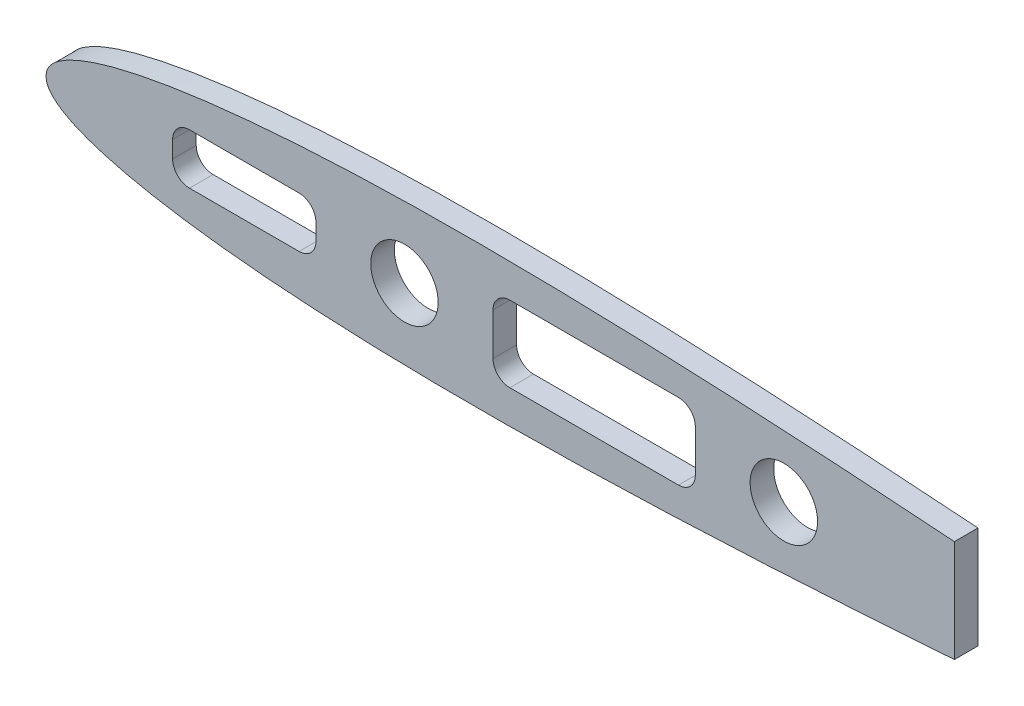
ISO-10303-21;
HEADER;
FILE_DESCRIPTION(('STEP AP214'),'2;1');
FILE_NAME('part.step','',(''),(''),'','','');
FILE_SCHEMA(('AUTOMOTIVE_DESIGN { 1 0 10303 214 1 1 1 1 }'));
ENDSEC;
DATA;
#1=APPLICATION_CONTEXT('core data for automotive mechanical design processes');
#2=APPLICATION_PROTOCOL_DEFINITION('international standard','automotive_design',2000,#1);
#3=PRODUCT_CONTEXT('',#1,'mechanical');
#4=PRODUCT('Part','Part','',(#3));
#5=PRODUCT_RELATED_PRODUCT_CATEGORY('part','',(#4));
#6=PRODUCT_DEFINITION_FORMATION('','',#4);
#7=PRODUCT_DEFINITION_CONTEXT('part definition',#1,'design');
#8=PRODUCT_DEFINITION('design','',#6,#7);
#9=PRODUCT_DEFINITION_SHAPE('','',#8);
#10=(LENGTH_UNIT() NAMED_UNIT(*) SI_UNIT(.MILLI.,.METRE.));
#11=(NAMED_UNIT(*) PLANE_ANGLE_UNIT() SI_UNIT($,.RADIAN.));
#12=(NAMED_UNIT(*) SI_UNIT($,.STERADIAN.) SOLID_ANGLE_UNIT());
#13=UNCERTAINTY_MEASURE_WITH_UNIT(LENGTH_MEASURE(1.E-05),#10,'distance_accuracy_value','');
#14=(GEOMETRIC_REPRESENTATION_CONTEXT(3) GLOBAL_UNCERTAINTY_ASSIGNED_CONTEXT((#13)) GLOBAL_UNIT_ASSIGNED_CONTEXT((#10,
#11,#12)) REPRESENTATION_CONTEXT('',''));
#15=CARTESIAN_POINT('',(0.,0.,0.));
#16=DIRECTION('',(0.,0.,1.));
#17=DIRECTION('',(1.,0.,0.));
#18=AXIS2_PLACEMENT_3D('',#15,#16,#17);
#19=CARTESIAN_POINT('',(217.74763411893,0.,1.4));
#20=DIRECTION('',(1.,0.,0.));
#21=DIRECTION('',(0.,0.,-1.));
#22=AXIS2_PLACEMENT_3D('',#19,#20,#21);
#23=PLANE('',#22);
#24=DIRECTION('',(0.,-1.,0.));
#25=VECTOR('',#24,1.);
#26=CARTESIAN_POINT('',(217.74763411893,0.,-1.4));
#27=LINE('',#26,#25);
#28=CARTESIAN_POINT('',(217.74763411893,6.05811307778919,-1.4));
#29=VERTEX_POINT('',#28);
#30=CARTESIAN_POINT('',(217.74763411893,-6.05811307778918,-1.4));
#31=VERTEX_POINT('',#30);
#32=EDGE_CURVE('E185',#29,#31,#27,.T.);
#33=ORIENTED_EDGE('',*,*,#32,.F.);
#34=DIRECTION('',(0.,0.,-1.));
#35=VECTOR('',#34,1.);
#36=CARTESIAN_POINT('',(217.74763411893,6.05811307778919,1.4));
#37=LINE('',#36,#35);
#38=CARTESIAN_POINT('',(217.74763411893,6.05811307778919,1.4));
#39=VERTEX_POINT('',#38);
#40=EDGE_CURVE('E11',#39,#29,#37,.T.);
#41=ORIENTED_EDGE('',*,*,#40,.F.);
#42=DIRECTION('',(0.,-1.,0.));
#43=VECTOR('',#42,1.);
#44=CARTESIAN_POINT('',(217.74763411893,0.,1.4));
#45=LINE('',#44,#43);
#46=CARTESIAN_POINT('',(217.74763411893,-6.05811307778918,1.4));
#47=VERTEX_POINT('',#46);
#48=EDGE_CURVE('E184',#39,#47,#45,.T.);
#49=ORIENTED_EDGE('',*,*,#48,.T.);
#50=DIRECTION('',(0.,0.,-1.));
#51=VECTOR('',#50,1.);
#52=CARTESIAN_POINT('',(217.74763411893,-6.05811307778918,1.4));
#53=LINE('',#52,#51);
#54=EDGE_CURVE('E129',#47,#31,#53,.T.);
#55=ORIENTED_EDGE('',*,*,#54,.T.);
#56=EDGE_LOOP('',(#33,#41,#49,#55));
#57=FACE_BOUND('',#56,.T.);
#58=ADVANCED_FACE('F41',(#57),#23,.T.);
#59=CARTESIAN_POINT('',(280.,0.1785,1.4));
#60=CARTESIAN_POINT('',(279.592043703671,0.226075897783467,1.4));
#61=CARTESIAN_POINT('',(278.452596210234,0.358958360844463,1.4));
#62=CARTESIAN_POINT('',(276.385426802208,0.596436481937331,1.4));
#63=CARTESIAN_POINT('',(273.651166983567,0.905304265461348,1.4));
#64=CARTESIAN_POINT('',(270.455833183168,1.25859090467058,1.4));
#65=CARTESIAN_POINT('',(266.898988861825,1.64260730411104,1.4));
#66=CARTESIAN_POINT('',(263.047743378214,2.04785660385741,1.4));
#67=CARTESIAN_POINT('',(258.952644661846,2.46718813772148,1.4));
#68=CARTESIAN_POINT('',(253.11611192075,3.04786904369115,1.4));
#69=CARTESIAN_POINT('',(247.071089235748,3.62220530992837,1.4));
#70=CARTESIAN_POINT('',(240.854179313273,4.18491264898859,1.4));
#71=CARTESIAN_POINT('',(236.038226964104,4.60581174883637,1.4));
#72=CARTESIAN_POINT('',(231.150377302514,5.0173511026198,1.4));
#73=CARTESIAN_POINT('',(226.209311113549,5.41695826474113,1.4));
#74=CARTESIAN_POINT('',(221.232257466585,5.802244474926,1.4));
#75=CARTESIAN_POINT('',(216.235178286272,6.17086457697306,1.4));
#76=CARTESIAN_POINT('',(211.232977593233,6.52047434958791,1.4));
#77=CARTESIAN_POINT('',(206.239642946259,6.84887299963153,1.4));
#78=CARTESIAN_POINT('',(201.268368916985,7.15382688632495,1.4));
#79=CARTESIAN_POINT('',(196.331634567492,7.43310533690328,1.4));
#80=CARTESIAN_POINT('',(191.441311474098,7.68460443906704,1.4));
#81=CARTESIAN_POINT('',(186.608700126931,7.90621829286941,1.4));
#82=CARTESIAN_POINT('',(181.844626933159,8.09595849303594,1.4));
#83=CARTESIAN_POINT('',(177.159453511195,8.25195768192942,1.4));
#84=CARTESIAN_POINT('',(172.563150271755,8.37248656398387,1.4));
#85=CARTESIAN_POINT('',(168.065295924147,8.45595366245417,1.4));
#86=CARTESIAN_POINT('',(163.675147454163,8.5010026998616,1.4));
#87=CARTESIAN_POINT('',(159.401643403725,8.50652296727326,1.4));
#88=CARTESIAN_POINT('',(155.253439755899,8.47152880790102,1.4));
#89=CARTESIAN_POINT('',(151.238917925322,8.39550607585732,1.4));
#90=CARTESIAN_POINT('',(147.366223919106,8.27798597685019,1.4));
#91=CARTESIAN_POINT('',(143.643266298458,8.11897556141504,1.4));
#92=CARTESIAN_POINT('',(140.077743555427,7.91867894287145,1.4));
#93=CARTESIAN_POINT('',(136.677139412155,7.67760454203032,1.4));
#94=CARTESIAN_POINT('',(133.44876289533,7.39648056861162,1.4));
#95=CARTESIAN_POINT('',(130.399721685833,7.07642431038863,1.4));
#96=CARTESIAN_POINT('',(127.536961088608,6.71865034112428,1.4));
#97=CARTESIAN_POINT('',(124.867245825052,6.32466607739586,1.4));
#98=CARTESIAN_POINT('',(122.397158973637,5.89612056643678,1.4));
#99=CARTESIAN_POINT('',(120.133109351335,5.43479747619412,1.4));
#100=CARTESIAN_POINT('',(118.081312132678,4.94256764101073,1.4));
#101=CARTESIAN_POINT('',(116.247665797811,4.42139238611828,1.4));
#102=CARTESIAN_POINT('',(114.637939719778,3.87306046577258,1.4));
#103=CARTESIAN_POINT('',(113.256788366372,3.29930923783808,1.4));
#104=CARTESIAN_POINT('',(112.109835923497,2.70130638754162,1.4));
#105=CARTESIAN_POINT('',(111.196336340545,2.07855523302877,1.4));
#106=CARTESIAN_POINT('',(110.530223641577,1.42706975809109,1.4));
#107=CARTESIAN_POINT('',(110.085538217979,0.734230220465984,1.4));
#108=CARTESIAN_POINT('',(110.027578175867,0.236721440142773,1.4));
#109=CARTESIAN_POINT('',(110.,0.,1.4));
#110=B_SPLINE_CURVE_WITH_KNOTS('',3,(#59,#60,#61,#62,#63,#64,#65,#66,#67,#68,#69,#70,#71,#72,
#73,#74,#75,#76,#77,#78,#79,#80,#81,#82,#83,#84,#85,#86,#87,#88,#89,#90,#91,#92,#93,#94,#95,#96,
#97,#98,#99,#100,#101,#102,#103,#104,#105,#106,#107,#108,#109),.UNSPECIFIED.,.F.,.F.,(4,1,1,1,1,
1,1,1,1,1,1,1,1,1,1,1,1,1,1,1,1,1,1,1,1,1,1,1,1,1,1,1,1,1,1,1,1,1,1,1,1,1,1,1,1,1,1,1,4),(0.,
0.00714472364101537,0.0199556607345446,0.0361960612227423,0.0550111837630616,0.0758789375062231,
0.0984288660950085,0.122375554002083,0.147487885417653,0.200459747132314,0.228005170188377,
0.256076453638138,0.284555151070125,0.31333276259982,0.342309553949656,0.371392651251454,
0.400495752426115,0.429537687145242,0.458441905920554,0.487136113386761,0.515551917136779,
0.543623846405843,0.571289984327897,0.598490809568145,0.625169613225281,0.651272029103837,
0.676746157949116,0.701541790883913,0.725611016556625,0.74890783507394,0.771387785068823,
0.793008138575143,0.813728032856974,0.833507815357633,0.852309696093785,0.870097310144046,
0.886835918069106,0.902492781713446,0.917037139140432,0.930441053860646,0.942679762162792,
0.953733567025024,0.963589785484808,0.97224701929817,0.979722225388436,0.986065145275041,
0.991385258303778,0.995900988803729,1.),.UNSPECIFIED.);
#111=DIRECTION('',(0.,0.,-1.));
#112=VECTOR('',#111,1.);
#113=SURFACE_OF_LINEAR_EXTRUSION('',#110,#112);
#114=CARTESIAN_POINT('',(280.,0.1785,-1.4));
#115=CARTESIAN_POINT('',(279.592043703671,0.226075897783467,-1.4));
#116=CARTESIAN_POINT('',(278.452596210234,0.358958360844463,-1.4));
#117=CARTESIAN_POINT('',(276.385426802208,0.596436481937331,-1.4));
#118=CARTESIAN_POINT('',(273.651166983567,0.905304265461348,-1.4));
#119=CARTESIAN_POINT('',(270.455833183168,1.25859090467058,-1.4));
#120=CARTESIAN_POINT('',(266.898988861825,1.64260730411104,-1.4));
#121=CARTESIAN_POINT('',(263.047743378214,2.04785660385741,-1.4));
#122=CARTESIAN_POINT('',(258.952644661846,2.46718813772148,-1.4));
#123=CARTESIAN_POINT('',(253.11611192075,3.04786904369115,-1.4));
#124=CARTESIAN_POINT('',(247.071089235748,3.62220530992837,-1.4));
#125=CARTESIAN_POINT('',(240.854179313273,4.18491264898859,-1.4));
#126=CARTESIAN_POINT('',(236.038226964104,4.60581174883637,-1.4));
#127=CARTESIAN_POINT('',(231.150377302514,5.0173511026198,-1.4));
#128=CARTESIAN_POINT('',(226.209311113549,5.41695826474113,-1.4));
#129=CARTESIAN_POINT('',(221.232257466585,5.802244474926,-1.4));
#130=CARTESIAN_POINT('',(216.235178286272,6.17086457697306,-1.4));
#131=CARTESIAN_POINT('',(211.232977593233,6.52047434958791,-1.4));
#132=CARTESIAN_POINT('',(206.239642946259,6.84887299963153,-1.4));
#133=CARTESIAN_POINT('',(201.268368916985,7.15382688632495,-1.4));
#134=CARTESIAN_POINT('',(196.331634567492,7.43310533690328,-1.4));
#135=CARTESIAN_POINT('',(191.441311474098,7.68460443906704,-1.4));
#136=CARTESIAN_POINT('',(186.608700126931,7.90621829286941,-1.4));
#137=CARTESIAN_POINT('',(181.844626933159,8.09595849303594,-1.4));
#138=CARTESIAN_POINT('',(177.159453511195,8.25195768192942,-1.4));
#139=CARTESIAN_POINT('',(172.563150271755,8.37248656398387,-1.4));
#140=CARTESIAN_POINT('',(168.065295924147,8.45595366245417,-1.4));
#141=CARTESIAN_POINT('',(163.675147454163,8.5010026998616,-1.4));
#142=CARTESIAN_POINT('',(159.401643403725,8.50652296727326,-1.4));
#143=CARTESIAN_POINT('',(155.253439755899,8.47152880790102,-1.4));
#144=CARTESIAN_POINT('',(151.238917925322,8.39550607585732,-1.4));
#145=CARTESIAN_POINT('',(147.366223919106,8.27798597685019,-1.4));
#146=CARTESIAN_POINT('',(143.643266298458,8.11897556141504,-1.4));
#147=CARTESIAN_POINT('',(140.077743555427,7.91867894287145,-1.4));
#148=CARTESIAN_POINT('',(136.677139412155,7.67760454203032,-1.4));
#149=CARTESIAN_POINT('',(133.44876289533,7.39648056861162,-1.4));
#150=CARTESIAN_POINT('',(130.399721685833,7.07642431038863,-1.4));
#151=CARTESIAN_POINT('',(127.536961088608,6.71865034112428,-1.4));
#152=CARTESIAN_POINT('',(124.867245825052,6.32466607739586,-1.4));
#153=CARTESIAN_POINT('',(122.397158973637,5.89612056643678,-1.4));
#154=CARTESIAN_POINT('',(120.133109351335,5.43479747619412,-1.4));
#155=CARTESIAN_POINT('',(118.081312132678,4.94256764101073,-1.4));
#156=CARTESIAN_POINT('',(116.247665797811,4.42139238611828,-1.4));
#157=CARTESIAN_POINT('',(114.637939719778,3.87306046577258,-1.4));
#158=CARTESIAN_POINT('',(113.256788366372,3.29930923783808,-1.4));
#159=CARTESIAN_POINT('',(112.109835923497,2.70130638754162,-1.4));
#160=CARTESIAN_POINT('',(111.196336340545,2.07855523302877,-1.4));
#161=CARTESIAN_POINT('',(110.530223641577,1.42706975809109,-1.4));
#162=CARTESIAN_POINT('',(110.085538217979,0.734230220465984,-1.4));
#163=CARTESIAN_POINT('',(110.027578175867,0.236721440142773,-1.4));
#164=CARTESIAN_POINT('',(110.,0.,-1.4));
#165=B_SPLINE_CURVE_WITH_KNOTS('',3,(#114,#115,#116,#117,#118,#119,#120,#121,#122,#123,#124,
#125,#126,#127,#128,#129,#130,#131,#132,#133,#134,#135,#136,#137,#138,#139,#140,#141,#142,#143,
#144,#145,#146,#147,#148,#149,#150,#151,#152,#153,#154,#155,#156,#157,#158,#159,#160,#161,#162,
#163,#164),.UNSPECIFIED.,.F.,.F.,(4,1,1,1,1,1,1,1,1,1,1,1,1,1,1,1,1,1,1,1,1,1,1,1,1,1,1,1,1,1,1,
1,1,1,1,1,1,1,1,1,1,1,1,1,1,1,1,1,4),(0.,0.00714472364101537,0.0199556607345446,
0.0361960612227423,0.0550111837630616,0.0758789375062231,0.0984288660950085,0.122375554002083,
0.147487885417653,0.200459747132314,0.228005170188377,0.256076453638138,0.284555151070125,
0.31333276259982,0.342309553949656,0.371392651251454,0.400495752426115,0.429537687145242,
0.458441905920554,0.487136113386761,0.515551917136779,0.543623846405843,0.571289984327897,
0.598490809568145,0.625169613225281,0.651272029103837,0.676746157949116,0.701541790883913,
0.725611016556625,0.74890783507394,0.771387785068823,0.793008138575143,0.813728032856974,
0.833507815357633,0.852309696093785,0.870097310144046,0.886835918069106,0.902492781713446,
0.917037139140432,0.930441053860646,0.942679762162792,0.953733567025024,0.963589785484808,
0.97224701929817,0.979722225388436,0.986065145275041,0.991385258303778,0.995900988803729,1.),.UNSPECIFIED.);
#166=CARTESIAN_POINT('',(110.,0.,-1.4));
#167=VERTEX_POINT('',#166);
#168=EDGE_CURVE('E366',#29,#167,#165,.T.);
#169=ORIENTED_EDGE('',*,*,#168,.T.);
#170=DIRECTION('',(0.,0.,-1.));
#171=VECTOR('',#170,1.);
#172=CARTESIAN_POINT('',(110.,0.,1.4));
#173=LINE('',#172,#171);
#174=CARTESIAN_POINT('',(110.,0.,1.4));
#175=VERTEX_POINT('',#174);
#176=EDGE_CURVE('E52',#175,#167,#173,.T.);
#177=ORIENTED_EDGE('',*,*,#176,.F.);
#178=EDGE_CURVE('E189',#39,#175,#110,.T.);
#179=ORIENTED_EDGE('',*,*,#178,.F.);
#180=ORIENTED_EDGE('',*,*,#40,.T.);
#181=EDGE_LOOP('',(#169,#177,#179,#180));
#182=FACE_BOUND('',#181,.T.);
#183=ADVANCED_FACE('F190',(#182),#113,.F.);
#184=CARTESIAN_POINT('',(163.018484280221,0.,1.4));
#185=DIRECTION('',(-1.,0.,0.));
#186=DIRECTION('',(0.,0.,1.));
#187=AXIS2_PLACEMENT_3D('',#184,#185,#186);
#188=PLANE('',#187);
#189=DIRECTION('',(0.,1.,0.));
#190=VECTOR('',#189,1.);
#191=CARTESIAN_POINT('',(163.018484280221,0.,-1.4));
#192=LINE('',#191,#190);
#193=CARTESIAN_POINT('',(163.018484280221,-2.5,-1.4));
#194=VERTEX_POINT('',#193);
#195=CARTESIAN_POINT('',(163.018484280221,2.5,-1.4));
#196=VERTEX_POINT('',#195);
#197=EDGE_CURVE('E327',#194,#196,#192,.T.);
#198=ORIENTED_EDGE('',*,*,#197,.T.);
#199=DIRECTION('',(0.,0.,-1.));
#200=VECTOR('',#199,1.);
#201=CARTESIAN_POINT('',(163.018484280221,2.5,1.4));
#202=LINE('',#201,#200);
#203=CARTESIAN_POINT('',(163.018484280221,2.5,1.4));
#204=VERTEX_POINT('',#203);
#205=EDGE_CURVE('E384',#204,#196,#202,.T.);
#206=ORIENTED_EDGE('',*,*,#205,.F.);
#207=DIRECTION('',(0.,1.,0.));
#208=VECTOR('',#207,1.);
#209=CARTESIAN_POINT('',(163.018484280221,0.,1.4));
#210=LINE('',#209,#208);
#211=CARTESIAN_POINT('',(163.018484280221,-2.5,1.4));
#212=VERTEX_POINT('',#211);
#213=EDGE_CURVE('E463',#212,#204,#210,.T.);
#214=ORIENTED_EDGE('',*,*,#213,.F.);
#215=DIRECTION('',(0.,0.,-1.));
#216=VECTOR('',#215,1.);
#217=CARTESIAN_POINT('',(163.018484280221,-2.5,1.4));
#218=LINE('',#217,#216);
#219=EDGE_CURVE('E387',#212,#194,#218,.T.);
#220=ORIENTED_EDGE('',*,*,#219,.T.);
#221=EDGE_LOOP('',(#198,#206,#214,#220));
#222=FACE_BOUND('',#221,.T.);
#223=ADVANCED_FACE('F217',(#222),#188,.F.);
#224=CARTESIAN_POINT('',(165.018484280221,2.5,1.4));
#225=DIRECTION('',(0.,0.,-1.));
#226=DIRECTION('',(-1.,0.,0.));
#227=AXIS2_PLACEMENT_3D('',#224,#225,#226);
#228=CYLINDRICAL_SURFACE('',#227,2.);
#229=CARTESIAN_POINT('',(165.018484280221,2.5,-1.4));
#230=DIRECTION('',(0.,0.,1.));
#231=DIRECTION('',(1.,0.,0.));
#232=AXIS2_PLACEMENT_3D('',#229,#230,#231);
#233=CIRCLE('',#232,2.);
#234=CARTESIAN_POINT('',(165.018484280221,4.5,-1.4));
#235=VERTEX_POINT('',#234);
#236=EDGE_CURVE('E331',#196,#235,#233,.F.);
#237=ORIENTED_EDGE('',*,*,#236,.T.);
#238=DIRECTION('',(0.,0.,-1.));
#239=VECTOR('',#238,1.);
#240=CARTESIAN_POINT('',(165.018484280221,4.5,1.4));
#241=LINE('',#240,#239);
#242=CARTESIAN_POINT('',(165.018484280221,4.5,1.4));
#243=VERTEX_POINT('',#242);
#244=EDGE_CURVE('E407',#243,#235,#241,.T.);
#245=ORIENTED_EDGE('',*,*,#244,.F.);
#246=CARTESIAN_POINT('',(165.018484280221,2.5,1.4));
#247=DIRECTION('',(0.,0.,1.));
#248=DIRECTION('',(1.,0.,0.));
#249=AXIS2_PLACEMENT_3D('',#246,#247,#248);
#250=CIRCLE('',#249,2.);
#251=EDGE_CURVE('E467',#204,#243,#250,.F.);
#252=ORIENTED_EDGE('',*,*,#251,.F.);
#253=ORIENTED_EDGE('',*,*,#205,.T.);
#254=EDGE_LOOP('',(#237,#245,#252,#253));
#255=FACE_BOUND('',#254,.T.);
#256=ADVANCED_FACE('F255',(#255),#228,.F.);
#257=CARTESIAN_POINT('',(0.,4.5,1.4));
#258=DIRECTION('',(0.,1.,0.));
#259=DIRECTION('',(0.,0.,1.));
#260=AXIS2_PLACEMENT_3D('',#257,#258,#259);
#261=PLANE('',#260);
#262=DIRECTION('',(1.,0.,0.));
#263=VECTOR('',#262,1.);
#264=CARTESIAN_POINT('',(0.,4.5,-1.4));
#265=LINE('',#264,#263);
#266=CARTESIAN_POINT('',(185.018484280221,4.5,-1.4));
#267=VERTEX_POINT('',#266);
#268=EDGE_CURVE('E334',#235,#267,#265,.T.);
#269=ORIENTED_EDGE('',*,*,#268,.T.);
#270=DIRECTION('',(0.,0.,-1.));
#271=VECTOR('',#270,1.);
#272=CARTESIAN_POINT('',(185.018484280221,4.5,1.4));
#273=LINE('',#272,#271);
#274=CARTESIAN_POINT('',(185.018484280221,4.5,1.4));
#275=VERTEX_POINT('',#274);
#276=EDGE_CURVE('E403',#275,#267,#273,.T.);
#277=ORIENTED_EDGE('',*,*,#276,.F.);
#278=DIRECTION('',(1.,0.,0.));
#279=VECTOR('',#278,1.);
#280=CARTESIAN_POINT('',(0.,4.5,1.4));
#281=LINE('',#280,#279);
#282=EDGE_CURVE('E470',#243,#275,#281,.T.);
#283=ORIENTED_EDGE('',*,*,#282,.F.);
#284=ORIENTED_EDGE('',*,*,#244,.T.);
#285=EDGE_LOOP('',(#269,#277,#283,#284));
#286=FACE_BOUND('',#285,.T.);
#287=ADVANCED_FACE('F251',(#286),#261,.F.);
#288=CARTESIAN_POINT('',(185.018484280221,2.5,1.4));
#289=DIRECTION('',(0.,0.,-1.));
#290=DIRECTION('',(-1.,0.,0.));
#291=AXIS2_PLACEMENT_3D('',#288,#289,#290);
#292=CYLINDRICAL_SURFACE('',#291,2.);
#293=CARTESIAN_POINT('',(185.018484280221,2.5,-1.4));
#294=DIRECTION('',(0.,0.,1.));
#295=DIRECTION('',(1.,0.,0.));
#296=AXIS2_PLACEMENT_3D('',#293,#294,#295);
#297=CIRCLE('',#296,2.);
#298=CARTESIAN_POINT('',(187.018484280221,2.5,-1.4));
#299=VERTEX_POINT('',#298);
#300=EDGE_CURVE('E337',#267,#299,#297,.F.);
#301=ORIENTED_EDGE('',*,*,#300,.T.);
#302=DIRECTION('',(0.,0.,-1.));
#303=VECTOR('',#302,1.);
#304=CARTESIAN_POINT('',(187.018484280221,2.5,1.4));
#305=LINE('',#304,#303);
#306=CARTESIAN_POINT('',(187.018484280221,2.5,1.4));
#307=VERTEX_POINT('',#306);
#308=EDGE_CURVE('E400',#307,#299,#305,.T.);
#309=ORIENTED_EDGE('',*,*,#308,.F.);
#310=CARTESIAN_POINT('',(185.018484280221,2.5,1.4));
#311=DIRECTION('',(0.,0.,1.));
#312=DIRECTION('',(1.,0.,0.));
#313=AXIS2_PLACEMENT_3D('',#310,#311,#312);
#314=CIRCLE('',#313,2.);
#315=EDGE_CURVE('E473',#275,#307,#314,.F.);
#316=ORIENTED_EDGE('',*,*,#315,.F.);
#317=ORIENTED_EDGE('',*,*,#276,.T.);
#318=EDGE_LOOP('',(#301,#309,#316,#317));
#319=FACE_BOUND('',#318,.T.);
#320=ADVANCED_FACE('F247',(#319),#292,.F.);
#321=CARTESIAN_POINT('',(187.018484280221,0.,1.4));
#322=DIRECTION('',(-1.,0.,0.));
#323=DIRECTION('',(0.,0.,1.));
#324=AXIS2_PLACEMENT_3D('',#321,#322,#323);
#325=PLANE('',#324);
#326=DIRECTION('',(0.,1.,0.));
#327=VECTOR('',#326,1.);
#328=CARTESIAN_POINT('',(187.018484280221,0.,-1.4));
#329=LINE('',#328,#327);
#330=CARTESIAN_POINT('',(187.018484280221,-2.5,-1.4));
#331=VERTEX_POINT('',#330);
#332=EDGE_CURVE('E341',#331,#299,#329,.T.);
#333=ORIENTED_EDGE('',*,*,#332,.F.);
#334=DIRECTION('',(0.,0.,-1.));
#335=VECTOR('',#334,1.);
#336=CARTESIAN_POINT('',(187.018484280221,-2.5,1.4));
#337=LINE('',#336,#335);
#338=CARTESIAN_POINT('',(187.018484280221,-2.5,1.4));
#339=VERTEX_POINT('',#338);
#340=EDGE_CURVE('E397',#339,#331,#337,.T.);
#341=ORIENTED_EDGE('',*,*,#340,.F.);
#342=DIRECTION('',(0.,1.,0.));
#343=VECTOR('',#342,1.);
#344=CARTESIAN_POINT('',(187.018484280221,0.,1.4));
#345=LINE('',#344,#343);
#346=EDGE_CURVE('E476',#339,#307,#345,.T.);
#347=ORIENTED_EDGE('',*,*,#346,.T.);
#348=ORIENTED_EDGE('',*,*,#308,.T.);
#349=EDGE_LOOP('',(#333,#341,#347,#348));
#350=FACE_BOUND('',#349,.T.);
#351=ADVANCED_FACE('F243',(#350),#325,.T.);
#352=CARTESIAN_POINT('',(185.018484280221,-2.5,1.4));
#353=DIRECTION('',(0.,0.,-1.));
#354=DIRECTION('',(-1.,0.,0.));
#355=AXIS2_PLACEMENT_3D('',#352,#353,#354);
#356=CYLINDRICAL_SURFACE('',#355,2.);
#357=CARTESIAN_POINT('',(185.018484280221,-2.5,-1.4));
#358=DIRECTION('',(0.,0.,1.));
#359=DIRECTION('',(1.,0.,0.));
#360=AXIS2_PLACEMENT_3D('',#357,#358,#359);
#361=CIRCLE('',#360,2.);
#362=CARTESIAN_POINT('',(185.018484280221,-4.5,-1.4));
#363=VERTEX_POINT('',#362);
#364=EDGE_CURVE('E345',#363,#331,#361,.T.);
#365=ORIENTED_EDGE('',*,*,#364,.F.);
#366=DIRECTION('',(0.,0.,-1.));
#367=VECTOR('',#366,1.);
#368=CARTESIAN_POINT('',(185.018484280221,-4.5,1.4));
#369=LINE('',#368,#367);
#370=CARTESIAN_POINT('',(185.018484280221,-4.5,1.4));
#371=VERTEX_POINT('',#370);
#372=EDGE_CURVE('E394',#371,#363,#369,.T.);
#373=ORIENTED_EDGE('',*,*,#372,.F.);
#374=CARTESIAN_POINT('',(185.018484280221,-2.5,1.4));
#375=DIRECTION('',(0.,0.,1.));
#376=DIRECTION('',(1.,0.,0.));
#377=AXIS2_PLACEMENT_3D('',#374,#375,#376);
#378=CIRCLE('',#377,2.);
#379=EDGE_CURVE('E480',#371,#339,#378,.T.);
#380=ORIENTED_EDGE('',*,*,#379,.T.);
#381=ORIENTED_EDGE('',*,*,#340,.T.);
#382=EDGE_LOOP('',(#365,#373,#380,#381));
#383=FACE_BOUND('',#382,.T.);
#384=ADVANCED_FACE('F239',(#383),#356,.F.);
#385=CARTESIAN_POINT('',(0.,-4.5,1.4));
#386=DIRECTION('',(0.,1.,0.));
#387=DIRECTION('',(0.,0.,1.));
#388=AXIS2_PLACEMENT_3D('',#385,#386,#387);
#389=PLANE('',#388);
#390=DIRECTION('',(1.,0.,0.));
#391=VECTOR('',#390,1.);
#392=CARTESIAN_POINT('',(0.,-4.5,-1.4));
#393=LINE('',#392,#391);
#394=CARTESIAN_POINT('',(165.018484280221,-4.5,-1.4));
#395=VERTEX_POINT('',#394);
#396=EDGE_CURVE('E349',#395,#363,#393,.T.);
#397=ORIENTED_EDGE('',*,*,#396,.F.);
#398=DIRECTION('',(0.,0.,-1.));
#399=VECTOR('',#398,1.);
#400=CARTESIAN_POINT('',(165.018484280221,-4.5,1.4));
#401=LINE('',#400,#399);
#402=CARTESIAN_POINT('',(165.018484280221,-4.5,1.4));
#403=VERTEX_POINT('',#402);
#404=EDGE_CURVE('E391',#403,#395,#401,.T.);
#405=ORIENTED_EDGE('',*,*,#404,.F.);
#406=DIRECTION('',(1.,0.,0.));
#407=VECTOR('',#406,1.);
#408=CARTESIAN_POINT('',(0.,-4.5,1.4));
#409=LINE('',#408,#407);
#410=EDGE_CURVE('E484',#403,#371,#409,.T.);
#411=ORIENTED_EDGE('',*,*,#410,.T.);
#412=ORIENTED_EDGE('',*,*,#372,.T.);
#413=EDGE_LOOP('',(#397,#405,#411,#412));
#414=FACE_BOUND('',#413,.T.);
#415=ADVANCED_FACE('F236',(#414),#389,.T.);
#416=CARTESIAN_POINT('',(0.,3.,1.4));
#417=DIRECTION('',(0.,1.,0.));
#418=DIRECTION('',(0.,0.,1.));
#419=AXIS2_PLACEMENT_3D('',#416,#417,#418);
#420=PLANE('',#419);
#421=DIRECTION('',(1.,0.,0.));
#422=VECTOR('',#421,1.);
#423=CARTESIAN_POINT('',(0.,3.,-1.4));
#424=LINE('',#423,#422);
#425=CARTESIAN_POINT('',(127.018484280221,3.,-1.4));
#426=VERTEX_POINT('',#425);
#427=CARTESIAN_POINT('',(140.018484280221,3.,-1.4));
#428=VERTEX_POINT('',#427);
#429=EDGE_CURVE('E301',#426,#428,#424,.T.);
#430=ORIENTED_EDGE('',*,*,#429,.T.);
#431=DIRECTION('',(0.,0.,-1.));
#432=VECTOR('',#431,1.);
#433=CARTESIAN_POINT('',(140.018484280221,3.,1.4));
#434=LINE('',#433,#432);
#435=CARTESIAN_POINT('',(140.018484280221,3.,1.4));
#436=VERTEX_POINT('',#435);
#437=EDGE_CURVE('E45',#436,#428,#434,.T.);
#438=ORIENTED_EDGE('',*,*,#437,.F.);
#439=DIRECTION('',(1.,0.,0.));
#440=VECTOR('',#439,1.);
#441=CARTESIAN_POINT('',(0.,3.,1.4));
#442=LINE('',#441,#440);
#443=CARTESIAN_POINT('',(127.018484280221,3.,1.4));
#444=VERTEX_POINT('',#443);
#445=EDGE_CURVE('E378',#444,#436,#442,.T.);
#446=ORIENTED_EDGE('',*,*,#445,.F.);
#447=DIRECTION('',(0.,0.,-1.));
#448=VECTOR('',#447,1.);
#449=CARTESIAN_POINT('',(127.018484280221,3.,1.4));
#450=LINE('',#449,#448);
#451=EDGE_CURVE('E414',#444,#426,#450,.T.);
#452=ORIENTED_EDGE('',*,*,#451,.T.);
#453=EDGE_LOOP('',(#430,#438,#446,#452));
#454=FACE_BOUND('',#453,.T.);
#455=ADVANCED_FACE('F43',(#454),#420,.F.);
#456=CARTESIAN_POINT('',(140.018484280221,1.,1.4));
#457=DIRECTION('',(0.,0.,-1.));
#458=DIRECTION('',(-1.,0.,0.));
#459=AXIS2_PLACEMENT_3D('',#456,#457,#458);
#460=CYLINDRICAL_SURFACE('',#459,2.);
#461=CARTESIAN_POINT('',(140.018484280221,1.,-1.4));
#462=DIRECTION('',(0.,0.,1.));
#463=DIRECTION('',(1.,0.,0.));
#464=AXIS2_PLACEMENT_3D('',#461,#462,#463);
#465=CIRCLE('',#464,2.);
#466=CARTESIAN_POINT('',(142.018484280221,0.999999999999986,-1.4));
#467=VERTEX_POINT('',#466);
#468=EDGE_CURVE('E291',#428,#467,#465,.F.);
#469=ORIENTED_EDGE('',*,*,#468,.T.);
#470=DIRECTION('',(0.,0.,-1.));
#471=VECTOR('',#470,1.);
#472=CARTESIAN_POINT('',(142.018484280221,0.999999999999986,1.4));
#473=LINE('',#472,#471);
#474=CARTESIAN_POINT('',(142.018484280221,0.999999999999986,1.4));
#475=VERTEX_POINT('',#474);
#476=EDGE_CURVE('E293',#475,#467,#473,.T.);
#477=ORIENTED_EDGE('',*,*,#476,.F.);
#478=CARTESIAN_POINT('',(140.018484280221,1.,1.4));
#479=DIRECTION('',(0.,0.,1.));
#480=DIRECTION('',(1.,0.,0.));
#481=AXIS2_PLACEMENT_3D('',#478,#479,#480);
#482=CIRCLE('',#481,2.);
#483=EDGE_CURVE('E137',#436,#475,#482,.F.);
#484=ORIENTED_EDGE('',*,*,#483,.F.);
#485=ORIENTED_EDGE('',*,*,#437,.T.);
#486=EDGE_LOOP('',(#469,#477,#484,#485));
#487=FACE_BOUND('',#486,.T.);
#488=ADVANCED_FACE('F283',(#487),#460,.F.);
#489=CARTESIAN_POINT('',(142.018484280221,0.,1.4));
#490=DIRECTION('',(-1.,0.,0.));
#491=DIRECTION('',(0.,0.,1.));
#492=AXIS2_PLACEMENT_3D('',#489,#490,#491);
#493=PLANE('',#492);
#494=DIRECTION('',(0.,1.,0.));
#495=VECTOR('',#494,1.);
#496=CARTESIAN_POINT('',(142.018484280221,0.,-1.4));
#497=LINE('',#496,#495);
#498=CARTESIAN_POINT('',(142.018484280221,-0.999999999999985,-1.4));
#499=VERTEX_POINT('',#498);
#500=EDGE_CURVE('E300',#499,#467,#497,.T.);
#501=ORIENTED_EDGE('',*,*,#500,.F.);
#502=DIRECTION('',(0.,0.,-1.));
#503=VECTOR('',#502,1.);
#504=CARTESIAN_POINT('',(142.018484280221,-0.999999999999985,1.4));
#505=LINE('',#504,#503);
#506=CARTESIAN_POINT('',(142.018484280221,-0.999999999999985,1.4));
#507=VERTEX_POINT('',#506);
#508=EDGE_CURVE('E432',#507,#499,#505,.T.);
#509=ORIENTED_EDGE('',*,*,#508,.F.);
#510=DIRECTION('',(0.,1.,0.));
#511=VECTOR('',#510,1.);
#512=CARTESIAN_POINT('',(142.018484280221,0.,1.4));
#513=LINE('',#512,#511);
#514=EDGE_CURVE('E437',#507,#475,#513,.T.);
#515=ORIENTED_EDGE('',*,*,#514,.T.);
#516=ORIENTED_EDGE('',*,*,#476,.T.);
#517=EDGE_LOOP('',(#501,#509,#515,#516));
#518=FACE_BOUND('',#517,.T.);
#519=ADVANCED_FACE('F280',(#518),#493,.T.);
#520=CARTESIAN_POINT('',(140.018484280221,-1.,1.4));
#521=DIRECTION('',(0.,0.,-1.));
#522=DIRECTION('',(-1.,0.,0.));
#523=AXIS2_PLACEMENT_3D('',#520,#521,#522);
#524=CYLINDRICAL_SURFACE('',#523,2.);
#525=CARTESIAN_POINT('',(140.018484280221,-1.,-1.4));
#526=DIRECTION('',(0.,0.,1.));
#527=DIRECTION('',(1.,0.,0.));
#528=AXIS2_PLACEMENT_3D('',#525,#526,#527);
#529=CIRCLE('',#528,2.);
#530=CARTESIAN_POINT('',(140.018484280221,-3.,-1.4));
#531=VERTEX_POINT('',#530);
#532=EDGE_CURVE('E309',#531,#499,#529,.T.);
#533=ORIENTED_EDGE('',*,*,#532,.F.);
#534=DIRECTION('',(0.,0.,-1.));
#535=VECTOR('',#534,1.);
#536=CARTESIAN_POINT('',(140.018484280221,-3.,1.4));
#537=LINE('',#536,#535);
#538=CARTESIAN_POINT('',(140.018484280221,-3.,1.4));
#539=VERTEX_POINT('',#538);
#540=EDGE_CURVE('E429',#539,#531,#537,.T.);
#541=ORIENTED_EDGE('',*,*,#540,.F.);
#542=CARTESIAN_POINT('',(140.018484280221,-1.,1.4));
#543=DIRECTION('',(0.,0.,1.));
#544=DIRECTION('',(1.,0.,0.));
#545=AXIS2_PLACEMENT_3D('',#542,#543,#544);
#546=CIRCLE('',#545,2.);
#547=EDGE_CURVE('E442',#539,#507,#546,.T.);
#548=ORIENTED_EDGE('',*,*,#547,.T.);
#549=ORIENTED_EDGE('',*,*,#508,.T.);
#550=EDGE_LOOP('',(#533,#541,#548,#549));
#551=FACE_BOUND('',#550,.T.);
#552=ADVANCED_FACE('F276',(#551),#524,.F.);
#553=CARTESIAN_POINT('',(0.,-3.,1.4));
#554=DIRECTION('',(0.,1.,0.));
#555=DIRECTION('',(0.,0.,1.));
#556=AXIS2_PLACEMENT_3D('',#553,#554,#555);
#557=PLANE('',#556);
#558=DIRECTION('',(1.,0.,0.));
#559=VECTOR('',#558,1.);
#560=CARTESIAN_POINT('',(0.,-3.,-1.4));
#561=LINE('',#560,#559);
#562=CARTESIAN_POINT('',(127.018484280221,-3.,-1.4));
#563=VERTEX_POINT('',#562);
#564=EDGE_CURVE('E313',#563,#531,#561,.T.);
#565=ORIENTED_EDGE('',*,*,#564,.F.);
#566=DIRECTION('',(0.,0.,-1.));
#567=VECTOR('',#566,1.);
#568=CARTESIAN_POINT('',(127.018484280221,-3.,1.4));
#569=LINE('',#568,#567);
#570=CARTESIAN_POINT('',(127.018484280221,-3.,1.4));
#571=VERTEX_POINT('',#570);
#572=EDGE_CURVE('E426',#571,#563,#569,.T.);
#573=ORIENTED_EDGE('',*,*,#572,.F.);
#574=DIRECTION('',(1.,0.,0.));
#575=VECTOR('',#574,1.);
#576=CARTESIAN_POINT('',(0.,-3.,1.4));
#577=LINE('',#576,#575);
#578=EDGE_CURVE('E446',#571,#539,#577,.T.);
#579=ORIENTED_EDGE('',*,*,#578,.T.);
#580=ORIENTED_EDGE('',*,*,#540,.T.);
#581=EDGE_LOOP('',(#565,#573,#579,#580));
#582=FACE_BOUND('',#581,.T.);
#583=ADVANCED_FACE('F272',(#582),#557,.T.);
#584=CARTESIAN_POINT('',(127.018484280221,-1.,1.4));
#585=DIRECTION('',(0.,0.,-1.));
#586=DIRECTION('',(-1.,0.,0.));
#587=AXIS2_PLACEMENT_3D('',#584,#585,#586);
#588=CYLINDRICAL_SURFACE('',#587,2.);
#589=CARTESIAN_POINT('',(127.018484280221,-1.,-1.4));
#590=DIRECTION('',(0.,0.,1.));
#591=DIRECTION('',(1.,0.,0.));
#592=AXIS2_PLACEMENT_3D('',#589,#590,#591);
#593=CIRCLE('',#592,2.);
#594=CARTESIAN_POINT('',(125.018484280221,-0.999999999999985,-1.4));
#595=VERTEX_POINT('',#594);
#596=EDGE_CURVE('E318',#563,#595,#593,.F.);
#597=ORIENTED_EDGE('',*,*,#596,.T.);
#598=DIRECTION('',(0.,0.,-1.));
#599=VECTOR('',#598,1.);
#600=CARTESIAN_POINT('',(125.018484280221,-0.999999999999985,1.4));
#601=LINE('',#600,#599);
#602=CARTESIAN_POINT('',(125.018484280221,-0.999999999999985,1.4));
#603=VERTEX_POINT('',#602);
#604=EDGE_CURVE('E422',#603,#595,#601,.T.);
#605=ORIENTED_EDGE('',*,*,#604,.F.);
#606=CARTESIAN_POINT('',(127.018484280221,-1.,1.4));
#607=DIRECTION('',(0.,0.,1.));
#608=DIRECTION('',(1.,0.,0.));
#609=AXIS2_PLACEMENT_3D('',#606,#607,#608);
#610=CIRCLE('',#609,2.);
#611=EDGE_CURVE('E454',#571,#603,#610,.F.);
#612=ORIENTED_EDGE('',*,*,#611,.F.);
#613=ORIENTED_EDGE('',*,*,#572,.T.);
#614=EDGE_LOOP('',(#597,#605,#612,#613));
#615=FACE_BOUND('',#614,.T.);
#616=ADVANCED_FACE('F268',(#615),#588,.F.);
#617=CARTESIAN_POINT('',(125.018484280221,0.,1.4));
#618=DIRECTION('',(-1.,0.,0.));
#619=DIRECTION('',(0.,0.,1.));
#620=AXIS2_PLACEMENT_3D('',#617,#618,#619);
#621=PLANE('',#620);
#622=DIRECTION('',(0.,1.,0.));
#623=VECTOR('',#622,1.);
#624=CARTESIAN_POINT('',(125.018484280221,0.,-1.4));
#625=LINE('',#624,#623);
#626=CARTESIAN_POINT('',(125.018484280221,0.999999999999986,-1.4));
#627=VERTEX_POINT('',#626);
#628=EDGE_CURVE('E321',#595,#627,#625,.T.);
#629=ORIENTED_EDGE('',*,*,#628,.T.);
#630=DIRECTION('',(0.,0.,-1.));
#631=VECTOR('',#630,1.);
#632=CARTESIAN_POINT('',(125.018484280221,0.999999999999986,1.4));
#633=LINE('',#632,#631);
#634=CARTESIAN_POINT('',(125.018484280221,0.999999999999986,1.4));
#635=VERTEX_POINT('',#634);
#636=EDGE_CURVE('E418',#635,#627,#633,.T.);
#637=ORIENTED_EDGE('',*,*,#636,.F.);
#638=DIRECTION('',(0.,1.,0.));
#639=VECTOR('',#638,1.);
#640=CARTESIAN_POINT('',(125.018484280221,0.,1.4));
#641=LINE('',#640,#639);
#642=EDGE_CURVE('E457',#603,#635,#641,.T.);
#643=ORIENTED_EDGE('',*,*,#642,.F.);
#644=ORIENTED_EDGE('',*,*,#604,.T.);
#645=EDGE_LOOP('',(#629,#637,#643,#644));
#646=FACE_BOUND('',#645,.T.);
#647=ADVANCED_FACE('F226',(#646),#621,.F.);
#648=CARTESIAN_POINT('',(197.518484280221,0.,1.4));
#649=DIRECTION('',(0.,0.,-1.));
#650=DIRECTION('',(-1.,0.,0.));
#651=AXIS2_PLACEMENT_3D('',#648,#649,#650);
#652=CYLINDRICAL_SURFACE('',#651,3.99999999999999);
#653=CARTESIAN_POINT('',(197.518484280221,0.,1.4));
#654=DIRECTION('',(0.,0.,1.));
#655=DIRECTION('',(1.,0.,0.));
#656=AXIS2_PLACEMENT_3D('',#653,#654,#655);
#657=CIRCLE('',#656,3.99999999999999);
#658=CARTESIAN_POINT('',(201.518484280221,0.,1.4));
#659=VERTEX_POINT('',#658);
#660=EDGE_CURVE('E195',#659,#659,#657,.T.);
#661=ORIENTED_EDGE('',*,*,#660,.T.);
#662=EDGE_LOOP('',(#661));
#663=FACE_BOUND('',#662,.T.);
#664=CARTESIAN_POINT('',(197.518484280221,0.,-1.4));
#665=DIRECTION('',(0.,0.,1.));
#666=DIRECTION('',(1.,0.,0.));
#667=AXIS2_PLACEMENT_3D('',#664,#665,#666);
#668=CIRCLE('',#667,3.99999999999999);
#669=CARTESIAN_POINT('',(201.518484280221,0.,-1.4));
#670=VERTEX_POINT('',#669);
#671=EDGE_CURVE('E360',#670,#670,#668,.T.);
#672=ORIENTED_EDGE('',*,*,#671,.F.);
#673=EDGE_LOOP('',(#672));
#674=FACE_BOUND('',#673,.T.);
#675=ADVANCED_FACE('F222',(#663,#674),#652,.F.);
#676=CARTESIAN_POINT('',(152.518484280221,0.,1.4));
#677=DIRECTION('',(0.,0.,-1.));
#678=DIRECTION('',(-1.,0.,0.));
#679=AXIS2_PLACEMENT_3D('',#676,#677,#678);
#680=CYLINDRICAL_SURFACE('',#679,3.99999999999999);
#681=CARTESIAN_POINT('',(152.518484280221,0.,1.4));
#682=DIRECTION('',(0.,0.,1.));
#683=DIRECTION('',(1.,0.,0.));
#684=AXIS2_PLACEMENT_3D('',#681,#682,#683);
#685=CIRCLE('',#684,3.99999999999999);
#686=CARTESIAN_POINT('',(156.518484280221,0.,1.4));
#687=VERTEX_POINT('',#686);
#688=EDGE_CURVE('E199',#687,#687,#685,.T.);
#689=ORIENTED_EDGE('',*,*,#688,.T.);
#690=EDGE_LOOP('',(#689));
#691=FACE_BOUND('',#690,.T.);
#692=CARTESIAN_POINT('',(152.518484280221,0.,-1.4));
#693=DIRECTION('',(0.,0.,1.));
#694=DIRECTION('',(1.,0.,0.));
#695=AXIS2_PLACEMENT_3D('',#692,#693,#694);
#696=CIRCLE('',#695,3.99999999999999);
#697=CARTESIAN_POINT('',(156.518484280221,0.,-1.4));
#698=VERTEX_POINT('',#697);
#699=EDGE_CURVE('E356',#698,#698,#696,.T.);
#700=ORIENTED_EDGE('',*,*,#699,.F.);
#701=EDGE_LOOP('',(#700));
#702=FACE_BOUND('',#701,.T.);
#703=ADVANCED_FACE('F225',(#691,#702),#680,.F.);
#704=CARTESIAN_POINT('',(165.018484280221,-2.5,1.4));
#705=DIRECTION('',(0.,0.,-1.));
#706=DIRECTION('',(-1.,0.,0.));
#707=AXIS2_PLACEMENT_3D('',#704,#705,#706);
#708=CYLINDRICAL_SURFACE('',#707,2.);
#709=CARTESIAN_POINT('',(165.018484280221,-2.5,-1.4));
#710=DIRECTION('',(0.,0.,1.));
#711=DIRECTION('',(1.,0.,0.));
#712=AXIS2_PLACEMENT_3D('',#709,#710,#711);
#713=CIRCLE('',#712,2.);
#714=EDGE_CURVE('E353',#395,#194,#713,.F.);
#715=ORIENTED_EDGE('',*,*,#714,.T.);
#716=ORIENTED_EDGE('',*,*,#219,.F.);
#717=CARTESIAN_POINT('',(165.018484280221,-2.5,1.4));
#718=DIRECTION('',(0.,0.,1.));
#719=DIRECTION('',(1.,0.,0.));
#720=AXIS2_PLACEMENT_3D('',#717,#718,#719);
#721=CIRCLE('',#720,2.);
#722=EDGE_CURVE('E488',#403,#212,#721,.F.);
#723=ORIENTED_EDGE('',*,*,#722,.F.);
#724=ORIENTED_EDGE('',*,*,#404,.T.);
#725=EDGE_LOOP('',(#715,#716,#723,#724));
#726=FACE_BOUND('',#725,.T.);
#727=ADVANCED_FACE('F230',(#726),#708,.F.);
#728=CARTESIAN_POINT('',(127.018484280221,1.,1.4));
#729=DIRECTION('',(0.,0.,-1.));
#730=DIRECTION('',(-1.,0.,0.));
#731=AXIS2_PLACEMENT_3D('',#728,#729,#730);
#732=CYLINDRICAL_SURFACE('',#731,2.);
#733=CARTESIAN_POINT('',(127.018484280221,1.,-1.4));
#734=DIRECTION('',(0.,0.,1.));
#735=DIRECTION('',(1.,0.,0.));
#736=AXIS2_PLACEMENT_3D('',#733,#734,#735);
#737=CIRCLE('',#736,2.);
#738=EDGE_CURVE('E324',#627,#426,#737,.F.);
#739=ORIENTED_EDGE('',*,*,#738,.T.);
#740=ORIENTED_EDGE('',*,*,#451,.F.);
#741=CARTESIAN_POINT('',(127.018484280221,1.,1.4));
#742=DIRECTION('',(0.,0.,1.));
#743=DIRECTION('',(1.,0.,0.));
#744=AXIS2_PLACEMENT_3D('',#741,#742,#743);
#745=CIRCLE('',#744,2.);
#746=EDGE_CURVE('E460',#635,#444,#745,.F.);
#747=ORIENTED_EDGE('',*,*,#746,.F.);
#748=ORIENTED_EDGE('',*,*,#636,.T.);
#749=EDGE_LOOP('',(#739,#740,#747,#748));
#750=FACE_BOUND('',#749,.T.);
#751=ADVANCED_FACE('F234',(#750),#732,.F.);
#752=CARTESIAN_POINT('',(110.,0.,1.4));
#753=CARTESIAN_POINT('',(110.027578175867,-0.236721440142772,1.4));
#754=CARTESIAN_POINT('',(110.085538217979,-0.734230220465975,1.4));
#755=CARTESIAN_POINT('',(110.530223641577,-1.42706975809109,1.4));
#756=CARTESIAN_POINT('',(111.196336340545,-2.07855523302878,1.4));
#757=CARTESIAN_POINT('',(112.109835923497,-2.70130638754161,1.4));
#758=CARTESIAN_POINT('',(113.256788366372,-3.29930923783809,1.4));
#759=CARTESIAN_POINT('',(114.637939719778,-3.87306046577258,1.4));
#760=CARTESIAN_POINT('',(116.24766579781,-4.42139238611828,1.4));
#761=CARTESIAN_POINT('',(118.081312132678,-4.94256764101073,1.4));
#762=CARTESIAN_POINT('',(120.133109351335,-5.43479747619412,1.4));
#763=CARTESIAN_POINT('',(122.397158973637,-5.89612056643677,1.4));
#764=CARTESIAN_POINT('',(124.867245825052,-6.32466607739586,1.4));
#765=CARTESIAN_POINT('',(127.536961088608,-6.71865034112428,1.4));
#766=CARTESIAN_POINT('',(130.399721685833,-7.07642431038863,1.4));
#767=CARTESIAN_POINT('',(133.44876289533,-7.39648056861162,1.4));
#768=CARTESIAN_POINT('',(136.677139412155,-7.67760454203032,1.4));
#769=CARTESIAN_POINT('',(140.077743555427,-7.91867894287145,1.4));
#770=CARTESIAN_POINT('',(143.643266298458,-8.11897556141504,1.4));
#771=CARTESIAN_POINT('',(147.366223919106,-8.27798597685019,1.4));
#772=CARTESIAN_POINT('',(151.238917925322,-8.39550607585732,1.4));
#773=CARTESIAN_POINT('',(155.253439755899,-8.47152880790102,1.4));
#774=CARTESIAN_POINT('',(159.401643403725,-8.50652296727325,1.4));
#775=CARTESIAN_POINT('',(163.675147454163,-8.5010026998616,1.4));
#776=CARTESIAN_POINT('',(168.065295924147,-8.45595366245417,1.4));
#777=CARTESIAN_POINT('',(172.563150271755,-8.37248656398386,1.4));
#778=CARTESIAN_POINT('',(177.159453511195,-8.25195768192942,1.4));
#779=CARTESIAN_POINT('',(181.844626933159,-8.09595849303594,1.4));
#780=CARTESIAN_POINT('',(186.60870012693,-7.90621829286941,1.4));
#781=CARTESIAN_POINT('',(191.441311474098,-7.68460443906704,1.4));
#782=CARTESIAN_POINT('',(196.331634567492,-7.43310533690328,1.4));
#783=CARTESIAN_POINT('',(201.268368916985,-7.15382688632495,1.4));
#784=CARTESIAN_POINT('',(206.239642946259,-6.84887299963153,1.4));
#785=CARTESIAN_POINT('',(211.232977593233,-6.52047434958792,1.4));
#786=CARTESIAN_POINT('',(216.235178286271,-6.17086457697306,1.4));
#787=CARTESIAN_POINT('',(221.232257466585,-5.802244474926,1.4));
#788=CARTESIAN_POINT('',(226.209311113548,-5.41695826474113,1.4));
#789=CARTESIAN_POINT('',(231.150377302515,-5.0173511026198,1.4));
#790=CARTESIAN_POINT('',(236.038226964104,-4.60581174883637,1.4));
#791=CARTESIAN_POINT('',(240.854179313273,-4.18491264898859,1.4));
#792=CARTESIAN_POINT('',(247.071089235748,-3.62220530992837,1.4));
#793=CARTESIAN_POINT('',(253.11611192075,-3.04786904369115,1.4));
#794=CARTESIAN_POINT('',(258.952644661846,-2.46718813772147,1.4));
#795=CARTESIAN_POINT('',(263.047743378214,-2.04785660385741,1.4));
#796=CARTESIAN_POINT('',(266.898988861825,-1.64260730411104,1.4));
#797=CARTESIAN_POINT('',(270.455833183168,-1.25859090467058,1.4));
#798=CARTESIAN_POINT('',(273.651166983567,-0.905304265461349,1.4));
#799=CARTESIAN_POINT('',(276.385426802208,-0.59643648193733,1.4));
#800=CARTESIAN_POINT('',(278.452596210234,-0.358958360844466,1.4));
#801=CARTESIAN_POINT('',(279.592043703671,-0.226075897783468,1.4));
#802=CARTESIAN_POINT('',(280.,-0.1785,1.4));
#803=B_SPLINE_CURVE_WITH_KNOTS('',3,(#752,#753,#754,#755,#756,#757,#758,#759,#760,#761,#762,
#763,#764,#765,#766,#767,#768,#769,#770,#771,#772,#773,#774,#775,#776,#777,#778,#779,#780,#781,
#782,#783,#784,#785,#786,#787,#788,#789,#790,#791,#792,#793,#794,#795,#796,#797,#798,#799,#800,
#801,#802),.UNSPECIFIED.,.F.,.F.,(4,1,1,1,1,1,1,1,1,1,1,1,1,1,1,1,1,1,1,1,1,1,1,1,1,1,1,1,1,1,1,
1,1,1,1,1,1,1,1,1,1,1,1,1,1,1,1,1,4),(0.,0.00409901119627066,0.00861474169622249,
0.013934854724959,0.0202777746115639,0.0277529807018305,0.0364102145151919,0.0462664329749759,
0.057320237837208,0.0695589461393541,0.0829628608595683,0.0975072182865541,0.113164081930894,
0.129902689855954,0.147690303906216,0.166492184642367,0.186271967143026,0.206991861424858,
0.228612214931177,0.25109216492606,0.274388983443375,0.298458209116087,0.323253842050884,
0.348727970896163,0.374830386774719,0.401509190431855,0.428710015672103,0.456376153594157,
0.484448082863221,0.512863886613239,0.541558094079446,0.570462312854758,0.599504247573885,
0.628607348748546,0.657690446050344,0.68666723740018,0.715444848929875,0.743923546361862,
0.771994829811623,0.799540252867686,0.852512114582347,0.877624445997917,0.901571133904992,
0.924121062493777,0.944988816236938,0.963803938777258,0.980044339265455,0.992855276358985,1.),.UNSPECIFIED.);
#804=DIRECTION('',(0.,0.,-1.));
#805=VECTOR('',#804,1.);
#806=SURFACE_OF_LINEAR_EXTRUSION('',#803,#805);
#807=CARTESIAN_POINT('',(110.,0.,-1.4));
#808=CARTESIAN_POINT('',(110.027578175867,-0.236721440142772,-1.4));
#809=CARTESIAN_POINT('',(110.085538217979,-0.734230220465975,-1.4));
#810=CARTESIAN_POINT('',(110.530223641577,-1.42706975809109,-1.4));
#811=CARTESIAN_POINT('',(111.196336340545,-2.07855523302878,-1.4));
#812=CARTESIAN_POINT('',(112.109835923497,-2.70130638754161,-1.4));
#813=CARTESIAN_POINT('',(113.256788366372,-3.29930923783809,-1.4));
#814=CARTESIAN_POINT('',(114.637939719778,-3.87306046577258,-1.4));
#815=CARTESIAN_POINT('',(116.24766579781,-4.42139238611828,-1.4));
#816=CARTESIAN_POINT('',(118.081312132678,-4.94256764101073,-1.4));
#817=CARTESIAN_POINT('',(120.133109351335,-5.43479747619412,-1.4));
#818=CARTESIAN_POINT('',(122.397158973637,-5.89612056643677,-1.4));
#819=CARTESIAN_POINT('',(124.867245825052,-6.32466607739586,-1.4));
#820=CARTESIAN_POINT('',(127.536961088608,-6.71865034112428,-1.4));
#821=CARTESIAN_POINT('',(130.399721685833,-7.07642431038863,-1.4));
#822=CARTESIAN_POINT('',(133.44876289533,-7.39648056861162,-1.4));
#823=CARTESIAN_POINT('',(136.677139412155,-7.67760454203032,-1.4));
#824=CARTESIAN_POINT('',(140.077743555427,-7.91867894287145,-1.4));
#825=CARTESIAN_POINT('',(143.643266298458,-8.11897556141504,-1.4));
#826=CARTESIAN_POINT('',(147.366223919106,-8.27798597685019,-1.4));
#827=CARTESIAN_POINT('',(151.238917925322,-8.39550607585732,-1.4));
#828=CARTESIAN_POINT('',(155.253439755899,-8.47152880790102,-1.4));
#829=CARTESIAN_POINT('',(159.401643403725,-8.50652296727325,-1.4));
#830=CARTESIAN_POINT('',(163.675147454163,-8.5010026998616,-1.4));
#831=CARTESIAN_POINT('',(168.065295924147,-8.45595366245417,-1.4));
#832=CARTESIAN_POINT('',(172.563150271755,-8.37248656398386,-1.4));
#833=CARTESIAN_POINT('',(177.159453511195,-8.25195768192942,-1.4));
#834=CARTESIAN_POINT('',(181.844626933159,-8.09595849303594,-1.4));
#835=CARTESIAN_POINT('',(186.60870012693,-7.90621829286941,-1.4));
#836=CARTESIAN_POINT('',(191.441311474098,-7.68460443906704,-1.4));
#837=CARTESIAN_POINT('',(196.331634567492,-7.43310533690328,-1.4));
#838=CARTESIAN_POINT('',(201.268368916985,-7.15382688632495,-1.4));
#839=CARTESIAN_POINT('',(206.239642946259,-6.84887299963153,-1.4));
#840=CARTESIAN_POINT('',(211.232977593233,-6.52047434958792,-1.4));
#841=CARTESIAN_POINT('',(216.235178286271,-6.17086457697306,-1.4));
#842=CARTESIAN_POINT('',(221.232257466585,-5.802244474926,-1.4));
#843=CARTESIAN_POINT('',(226.209311113548,-5.41695826474113,-1.4));
#844=CARTESIAN_POINT('',(231.150377302515,-5.0173511026198,-1.4));
#845=CARTESIAN_POINT('',(236.038226964104,-4.60581174883637,-1.4));
#846=CARTESIAN_POINT('',(240.854179313273,-4.18491264898859,-1.4));
#847=CARTESIAN_POINT('',(247.071089235748,-3.62220530992837,-1.4));
#848=CARTESIAN_POINT('',(253.11611192075,-3.04786904369115,-1.4));
#849=CARTESIAN_POINT('',(258.952644661846,-2.46718813772147,-1.4));
#850=CARTESIAN_POINT('',(263.047743378214,-2.04785660385741,-1.4));
#851=CARTESIAN_POINT('',(266.898988861825,-1.64260730411104,-1.4));
#852=CARTESIAN_POINT('',(270.455833183168,-1.25859090467058,-1.4));
#853=CARTESIAN_POINT('',(273.651166983567,-0.905304265461349,-1.4));
#854=CARTESIAN_POINT('',(276.385426802208,-0.59643648193733,-1.4));
#855=CARTESIAN_POINT('',(278.452596210234,-0.358958360844466,-1.4));
#856=CARTESIAN_POINT('',(279.592043703671,-0.226075897783468,-1.4));
#857=CARTESIAN_POINT('',(280.,-0.1785,-1.4));
#858=B_SPLINE_CURVE_WITH_KNOTS('',3,(#807,#808,#809,#810,#811,#812,#813,#814,#815,#816,#817,
#818,#819,#820,#821,#822,#823,#824,#825,#826,#827,#828,#829,#830,#831,#832,#833,#834,#835,#836,
#837,#838,#839,#840,#841,#842,#843,#844,#845,#846,#847,#848,#849,#850,#851,#852,#853,#854,#855,
#856,#857),.UNSPECIFIED.,.F.,.F.,(4,1,1,1,1,1,1,1,1,1,1,1,1,1,1,1,1,1,1,1,1,1,1,1,1,1,1,1,1,1,1,
1,1,1,1,1,1,1,1,1,1,1,1,1,1,1,1,1,4),(0.,0.00409901119627066,0.00861474169622249,
0.013934854724959,0.0202777746115639,0.0277529807018305,0.0364102145151919,0.0462664329749759,
0.057320237837208,0.0695589461393541,0.0829628608595683,0.0975072182865541,0.113164081930894,
0.129902689855954,0.147690303906216,0.166492184642367,0.186271967143026,0.206991861424858,
0.228612214931177,0.25109216492606,0.274388983443375,0.298458209116087,0.323253842050884,
0.348727970896163,0.374830386774719,0.401509190431855,0.428710015672103,0.456376153594157,
0.484448082863221,0.512863886613239,0.541558094079446,0.570462312854758,0.599504247573885,
0.628607348748546,0.657690446050344,0.68666723740018,0.715444848929875,0.743923546361862,
0.771994829811623,0.799540252867686,0.852512114582347,0.877624445997917,0.901571133904992,
0.924121062493777,0.944988816236938,0.963803938777258,0.980044339265455,0.992855276358985,1.),.UNSPECIFIED.);
#859=EDGE_CURVE('E122',#167,#31,#858,.T.);
#860=ORIENTED_EDGE('',*,*,#859,.T.);
#861=ORIENTED_EDGE('',*,*,#54,.F.);
#862=EDGE_CURVE('E61',#175,#47,#803,.T.);
#863=ORIENTED_EDGE('',*,*,#862,.F.);
#864=ORIENTED_EDGE('',*,*,#176,.T.);
#865=EDGE_LOOP('',(#860,#861,#863,#864));
#866=FACE_BOUND('',#865,.T.);
#867=ADVANCED_FACE('F218',(#866),#806,.F.);
#868=CARTESIAN_POINT('',(0.,0.,1.4));
#869=DIRECTION('',(0.,0.,1.));
#870=DIRECTION('',(1.,0.,0.));
#871=AXIS2_PLACEMENT_3D('',#868,#869,#870);
#872=PLANE('',#871);
#873=ORIENTED_EDGE('',*,*,#445,.T.);
#874=ORIENTED_EDGE('',*,*,#483,.T.);
#875=ORIENTED_EDGE('',*,*,#514,.F.);
#876=ORIENTED_EDGE('',*,*,#547,.F.);
#877=ORIENTED_EDGE('',*,*,#578,.F.);
#878=ORIENTED_EDGE('',*,*,#611,.T.);
#879=ORIENTED_EDGE('',*,*,#642,.T.);
#880=ORIENTED_EDGE('',*,*,#746,.T.);
#881=EDGE_LOOP('',(#873,#874,#875,#876,#877,#878,#879,#880));
#882=FACE_BOUND('',#881,.T.);
#883=ORIENTED_EDGE('',*,*,#213,.T.);
#884=ORIENTED_EDGE('',*,*,#251,.T.);
#885=ORIENTED_EDGE('',*,*,#282,.T.);
#886=ORIENTED_EDGE('',*,*,#315,.T.);
#887=ORIENTED_EDGE('',*,*,#346,.F.);
#888=ORIENTED_EDGE('',*,*,#379,.F.);
#889=ORIENTED_EDGE('',*,*,#410,.F.);
#890=ORIENTED_EDGE('',*,*,#722,.T.);
#891=EDGE_LOOP('',(#883,#884,#885,#886,#887,#888,#889,#890));
#892=FACE_BOUND('',#891,.T.);
#893=ORIENTED_EDGE('',*,*,#688,.F.);
#894=EDGE_LOOP('',(#893));
#895=FACE_BOUND('',#894,.T.);
#896=ORIENTED_EDGE('',*,*,#660,.F.);
#897=EDGE_LOOP('',(#896));
#898=FACE_BOUND('',#897,.T.);
#899=ORIENTED_EDGE('',*,*,#48,.F.);
#900=ORIENTED_EDGE('',*,*,#178,.T.);
#901=ORIENTED_EDGE('',*,*,#862,.T.);
#902=EDGE_LOOP('',(#899,#900,#901));
#903=FACE_BOUND('',#902,.T.);
#904=ADVANCED_FACE('F193',(#882,#892,#895,#898,#903),#872,.T.);
#905=CARTESIAN_POINT('',(0.,0.,-1.4));
#906=DIRECTION('',(0.,0.,1.));
#907=DIRECTION('',(1.,0.,0.));
#908=AXIS2_PLACEMENT_3D('',#905,#906,#907);
#909=PLANE('',#908);
#910=ORIENTED_EDGE('',*,*,#429,.F.);
#911=ORIENTED_EDGE('',*,*,#738,.F.);
#912=ORIENTED_EDGE('',*,*,#628,.F.);
#913=ORIENTED_EDGE('',*,*,#596,.F.);
#914=ORIENTED_EDGE('',*,*,#564,.T.);
#915=ORIENTED_EDGE('',*,*,#532,.T.);
#916=ORIENTED_EDGE('',*,*,#500,.T.);
#917=ORIENTED_EDGE('',*,*,#468,.F.);
#918=EDGE_LOOP('',(#910,#911,#912,#913,#914,#915,#916,#917));
#919=FACE_BOUND('',#918,.T.);
#920=ORIENTED_EDGE('',*,*,#197,.F.);
#921=ORIENTED_EDGE('',*,*,#714,.F.);
#922=ORIENTED_EDGE('',*,*,#396,.T.);
#923=ORIENTED_EDGE('',*,*,#364,.T.);
#924=ORIENTED_EDGE('',*,*,#332,.T.);
#925=ORIENTED_EDGE('',*,*,#300,.F.);
#926=ORIENTED_EDGE('',*,*,#268,.F.);
#927=ORIENTED_EDGE('',*,*,#236,.F.);
#928=EDGE_LOOP('',(#920,#921,#922,#923,#924,#925,#926,#927));
#929=FACE_BOUND('',#928,.T.);
#930=ORIENTED_EDGE('',*,*,#699,.T.);
#931=EDGE_LOOP('',(#930));
#932=FACE_BOUND('',#931,.T.);
#933=ORIENTED_EDGE('',*,*,#671,.T.);
#934=EDGE_LOOP('',(#933));
#935=FACE_BOUND('',#934,.T.);
#936=ORIENTED_EDGE('',*,*,#32,.T.);
#937=ORIENTED_EDGE('',*,*,#859,.F.);
#938=ORIENTED_EDGE('',*,*,#168,.F.);
#939=EDGE_LOOP('',(#936,#937,#938));
#940=FACE_BOUND('',#939,.T.);
#941=ADVANCED_FACE('F305',(#919,#929,#932,#935,#940),#909,.F.);
#942=CLOSED_SHELL('',(#58,#183,#223,#256,#287,#320,#351,#384,#415,#455,#488,#519,#552,#583,#616,
#647,#675,#703,#727,#751,#867,#904,#941));
#943=MANIFOLD_SOLID_BREP('B2',#942);
#944=ADVANCED_BREP_SHAPE_REPRESENTATION('',(#18,#943),#14);
#945=SHAPE_DEFINITION_REPRESENTATION(#9,#944);
ENDSEC;
END-ISO-10303-21;
